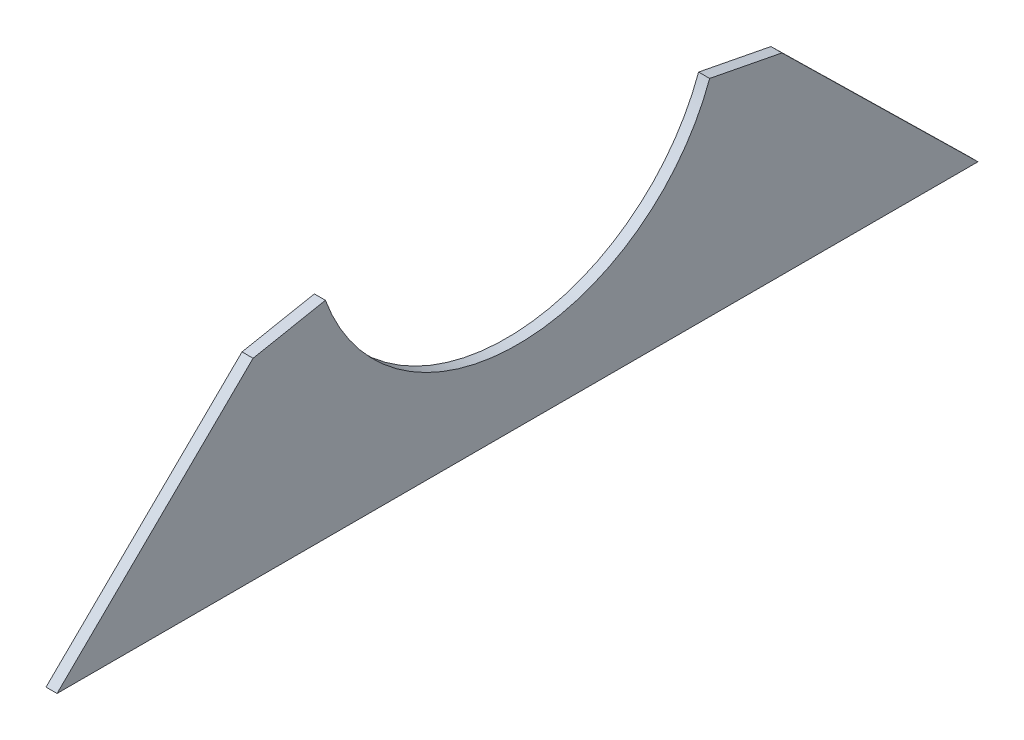
ISO-10303-21;
HEADER;
FILE_DESCRIPTION(('STEP AP214'),'2;1');
FILE_NAME('part.step','',(''),(''),'','','');
FILE_SCHEMA(('AUTOMOTIVE_DESIGN { 1 0 10303 214 1 1 1 1 }'));
ENDSEC;
DATA;
#1=APPLICATION_CONTEXT('core data for automotive mechanical design processes');
#2=APPLICATION_PROTOCOL_DEFINITION('international standard','automotive_design',2000,#1);
#3=PRODUCT_CONTEXT('',#1,'mechanical');
#4=PRODUCT('Part','Part','',(#3));
#5=PRODUCT_RELATED_PRODUCT_CATEGORY('part','',(#4));
#6=PRODUCT_DEFINITION_FORMATION('','',#4);
#7=PRODUCT_DEFINITION_CONTEXT('part definition',#1,'design');
#8=PRODUCT_DEFINITION('design','',#6,#7);
#9=PRODUCT_DEFINITION_SHAPE('','',#8);
#10=(LENGTH_UNIT() NAMED_UNIT(*) SI_UNIT(.MILLI.,.METRE.));
#11=(NAMED_UNIT(*) PLANE_ANGLE_UNIT() SI_UNIT($,.RADIAN.));
#12=(NAMED_UNIT(*) SI_UNIT($,.STERADIAN.) SOLID_ANGLE_UNIT());
#13=UNCERTAINTY_MEASURE_WITH_UNIT(LENGTH_MEASURE(1.E-05),#10,'distance_accuracy_value','');
#14=(GEOMETRIC_REPRESENTATION_CONTEXT(3) GLOBAL_UNCERTAINTY_ASSIGNED_CONTEXT((#13)) GLOBAL_UNIT_ASSIGNED_CONTEXT((#10,
#11,#12)) REPRESENTATION_CONTEXT('',''));
#15=CARTESIAN_POINT('',(0.,0.,0.));
#16=DIRECTION('',(0.,0.,1.));
#17=DIRECTION('',(1.,0.,0.));
#18=AXIS2_PLACEMENT_3D('',#15,#16,#17);
#19=CARTESIAN_POINT('',(-6.,-45.5965957242111,-143.570968245142));
#20=DIRECTION('',(0.,0.713867546087755,-0.70028074844497));
#21=DIRECTION('',(0.,0.70028074844497,0.713867546087755));
#22=AXIS2_PLACEMENT_3D('',#19,#20,#21);
#23=PLANE('',#22);
#24=DIRECTION('',(0.,0.70028074844497,0.713867546087755));
#25=VECTOR('',#24,1.);
#26=CARTESIAN_POINT('',(0.,-45.5965957242111,-143.570968245142));
#27=LINE('',#26,#25);
#28=CARTESIAN_POINT('',(0.,-150.,-250.));
#29=VERTEX_POINT('',#28);
#30=CARTESIAN_POINT('',(0.,-45.5965957242111,-143.570968245142));
#31=VERTEX_POINT('',#30);
#32=EDGE_CURVE('E130',#29,#31,#27,.T.);
#33=ORIENTED_EDGE('',*,*,#32,.F.);
#34=DIRECTION('',(1.,0.,0.));
#35=VECTOR('',#34,1.);
#36=CARTESIAN_POINT('',(-6.,-150.,-250.));
#37=LINE('',#36,#35);
#38=CARTESIAN_POINT('',(-6.,-150.,-250.));
#39=VERTEX_POINT('',#38);
#40=EDGE_CURVE('E11',#39,#29,#37,.T.);
#41=ORIENTED_EDGE('',*,*,#40,.F.);
#42=DIRECTION('',(0.,0.70028074844497,0.713867546087755));
#43=VECTOR('',#42,1.);
#44=CARTESIAN_POINT('',(-6.,-45.5965957242111,-143.570968245142));
#45=LINE('',#44,#43);
#46=CARTESIAN_POINT('',(-6.,-45.5965957242111,-143.570968245142));
#47=VERTEX_POINT('',#46);
#48=EDGE_CURVE('E144',#39,#47,#45,.T.);
#49=ORIENTED_EDGE('',*,*,#48,.T.);
#50=DIRECTION('',(1.,0.,0.));
#51=VECTOR('',#50,1.);
#52=CARTESIAN_POINT('',(-6.,-45.5965957242111,-143.570968245142));
#53=LINE('',#52,#51);
#54=EDGE_CURVE('E48',#47,#31,#53,.T.);
#55=ORIENTED_EDGE('',*,*,#54,.T.);
#56=EDGE_LOOP('',(#33,#41,#49,#55));
#57=FACE_BOUND('',#56,.T.);
#58=ADVANCED_FACE('F45',(#57),#23,.T.);
#59=CARTESIAN_POINT('',(-6.,-150.,-250.));
#60=DIRECTION('',(0.,-1.,0.));
#61=DIRECTION('',(0.,0.,-1.));
#62=AXIS2_PLACEMENT_3D('',#59,#60,#61);
#63=PLANE('',#62);
#64=DIRECTION('',(0.,0.,-1.));
#65=VECTOR('',#64,1.);
#66=CARTESIAN_POINT('',(0.,-150.,-250.));
#67=LINE('',#66,#65);
#68=CARTESIAN_POINT('',(0.,-150.,250.));
#69=VERTEX_POINT('',#68);
#70=EDGE_CURVE('E142',#69,#29,#67,.T.);
#71=ORIENTED_EDGE('',*,*,#70,.F.);
#72=DIRECTION('',(1.,0.,0.));
#73=VECTOR('',#72,1.);
#74=CARTESIAN_POINT('',(-6.,-150.,250.));
#75=LINE('',#74,#73);
#76=CARTESIAN_POINT('',(-6.,-150.,250.));
#77=VERTEX_POINT('',#76);
#78=EDGE_CURVE('E54',#77,#69,#75,.T.);
#79=ORIENTED_EDGE('',*,*,#78,.F.);
#80=DIRECTION('',(0.,0.,-1.));
#81=VECTOR('',#80,1.);
#82=CARTESIAN_POINT('',(-6.,-150.,-250.));
#83=LINE('',#82,#81);
#84=EDGE_CURVE('E120',#77,#39,#83,.T.);
#85=ORIENTED_EDGE('',*,*,#84,.T.);
#86=ORIENTED_EDGE('',*,*,#40,.T.);
#87=EDGE_LOOP('',(#71,#79,#85,#86));
#88=FACE_BOUND('',#87,.T.);
#89=ADVANCED_FACE('F152',(#88),#63,.T.);
#90=CARTESIAN_POINT('',(-6.,-45.5965957242111,143.570968245142));
#91=DIRECTION('',(0.,0.713867546087754,0.70028074844497));
#92=DIRECTION('',(0.,-0.70028074844497,0.713867546087754));
#93=AXIS2_PLACEMENT_3D('',#90,#91,#92);
#94=PLANE('',#93);
#95=DIRECTION('',(0.,-0.70028074844497,0.713867546087754));
#96=VECTOR('',#95,1.);
#97=CARTESIAN_POINT('',(0.,-45.5965957242111,143.570968245142));
#98=LINE('',#97,#96);
#99=CARTESIAN_POINT('',(0.,-45.5965957242111,143.570968245142));
#100=VERTEX_POINT('',#99);
#101=EDGE_CURVE('E107',#100,#69,#98,.T.);
#102=ORIENTED_EDGE('',*,*,#101,.F.);
#103=DIRECTION('',(1.,0.,0.));
#104=VECTOR('',#103,1.);
#105=CARTESIAN_POINT('',(-6.,-45.5965957242111,143.570968245142));
#106=LINE('',#105,#104);
#107=CARTESIAN_POINT('',(-6.,-45.5965957242111,143.570968245142));
#108=VERTEX_POINT('',#107);
#109=EDGE_CURVE('E102',#108,#100,#106,.T.);
#110=ORIENTED_EDGE('',*,*,#109,.F.);
#111=DIRECTION('',(0.,-0.70028074844497,0.713867546087754));
#112=VECTOR('',#111,1.);
#113=CARTESIAN_POINT('',(-6.,-45.5965957242111,143.570968245142));
#114=LINE('',#113,#112);
#115=EDGE_CURVE('E105',#108,#77,#114,.T.);
#116=ORIENTED_EDGE('',*,*,#115,.T.);
#117=ORIENTED_EDGE('',*,*,#78,.T.);
#118=EDGE_LOOP('',(#102,#110,#116,#117));
#119=FACE_BOUND('',#118,.T.);
#120=ADVANCED_FACE('F104',(#119),#94,.T.);
#121=CARTESIAN_POINT('',(-6.,-37.9642359091493,104.305880907236));
#122=DIRECTION('',(0.,0.981627183447664,0.190808995376544));
#123=DIRECTION('',(0.,-0.190808995376544,0.981627183447664));
#124=AXIS2_PLACEMENT_3D('',#121,#122,#123);
#125=PLANE('',#124);
#126=DIRECTION('',(0.,-0.190808995376544,0.981627183447664));
#127=VECTOR('',#126,1.);
#128=CARTESIAN_POINT('',(0.,-37.9642359091493,104.305880907236));
#129=LINE('',#128,#127);
#130=CARTESIAN_POINT('',(0.,-37.9642359091493,104.305880907236));
#131=VERTEX_POINT('',#130);
#132=EDGE_CURVE('E139',#131,#100,#129,.T.);
#133=ORIENTED_EDGE('',*,*,#132,.F.);
#134=DIRECTION('',(1.,0.,0.));
#135=VECTOR('',#134,1.);
#136=CARTESIAN_POINT('',(-6.,-37.9642359091493,104.305880907236));
#137=LINE('',#136,#135);
#138=CARTESIAN_POINT('',(-6.,-37.9642359091493,104.305880907236));
#139=VERTEX_POINT('',#138);
#140=EDGE_CURVE('E112',#139,#131,#137,.T.);
#141=ORIENTED_EDGE('',*,*,#140,.F.);
#142=DIRECTION('',(0.,-0.190808995376544,0.981627183447664));
#143=VECTOR('',#142,1.);
#144=CARTESIAN_POINT('',(-6.,-37.9642359091493,104.305880907236));
#145=LINE('',#144,#143);
#146=EDGE_CURVE('E118',#139,#108,#145,.T.);
#147=ORIENTED_EDGE('',*,*,#146,.T.);
#148=ORIENTED_EDGE('',*,*,#109,.T.);
#149=EDGE_LOOP('',(#133,#141,#147,#148));
#150=FACE_BOUND('',#149,.T.);
#151=ADVANCED_FACE('F122',(#150),#125,.T.);
#152=CARTESIAN_POINT('',(-6.,0.,0.));
#153=DIRECTION('',(1.,0.,0.));
#154=DIRECTION('',(0.,0.,-1.));
#155=AXIS2_PLACEMENT_3D('',#152,#153,#154);
#156=CYLINDRICAL_SURFACE('',#155,111.);
#157=CARTESIAN_POINT('',(0.,0.,0.));
#158=DIRECTION('',(-1.,0.,0.));
#159=DIRECTION('',(0.,0.,-1.));
#160=AXIS2_PLACEMENT_3D('',#157,#158,#159);
#161=CIRCLE('',#160,111.);
#162=CARTESIAN_POINT('',(0.,-37.9642359091493,-104.305880907236));
#163=VERTEX_POINT('',#162);
#164=EDGE_CURVE('E136',#163,#131,#161,.T.);
#165=ORIENTED_EDGE('',*,*,#164,.F.);
#166=DIRECTION('',(1.,0.,0.));
#167=VECTOR('',#166,1.);
#168=CARTESIAN_POINT('',(-6.,-37.9642359091493,-104.305880907236));
#169=LINE('',#168,#167);
#170=CARTESIAN_POINT('',(-6.,-37.9642359091493,-104.305880907236));
#171=VERTEX_POINT('',#170);
#172=EDGE_CURVE('E147',#171,#163,#169,.T.);
#173=ORIENTED_EDGE('',*,*,#172,.F.);
#174=CARTESIAN_POINT('',(-6.,0.,0.));
#175=DIRECTION('',(-1.,0.,0.));
#176=DIRECTION('',(0.,0.,-1.));
#177=AXIS2_PLACEMENT_3D('',#174,#175,#176);
#178=CIRCLE('',#177,111.);
#179=EDGE_CURVE('E123',#171,#139,#178,.T.);
#180=ORIENTED_EDGE('',*,*,#179,.T.);
#181=ORIENTED_EDGE('',*,*,#140,.T.);
#182=EDGE_LOOP('',(#165,#173,#180,#181));
#183=FACE_BOUND('',#182,.T.);
#184=ADVANCED_FACE('F165',(#183),#156,.F.);
#185=CARTESIAN_POINT('',(-6.,-37.9642359091493,-104.305880907236));
#186=DIRECTION('',(0.,0.981627183447664,-0.190808995376544));
#187=DIRECTION('',(0.,0.190808995376544,0.981627183447664));
#188=AXIS2_PLACEMENT_3D('',#185,#186,#187);
#189=PLANE('',#188);
#190=DIRECTION('',(0.,0.190808995376544,0.981627183447664));
#191=VECTOR('',#190,1.);
#192=CARTESIAN_POINT('',(0.,-37.9642359091493,-104.305880907236));
#193=LINE('',#192,#191);
#194=EDGE_CURVE('E133',#31,#163,#193,.T.);
#195=ORIENTED_EDGE('',*,*,#194,.F.);
#196=ORIENTED_EDGE('',*,*,#54,.F.);
#197=DIRECTION('',(0.,0.190808995376544,0.981627183447664));
#198=VECTOR('',#197,1.);
#199=CARTESIAN_POINT('',(-6.,-37.9642359091493,-104.305880907236));
#200=LINE('',#199,#198);
#201=EDGE_CURVE('E125',#47,#171,#200,.T.);
#202=ORIENTED_EDGE('',*,*,#201,.T.);
#203=ORIENTED_EDGE('',*,*,#172,.T.);
#204=EDGE_LOOP('',(#195,#196,#202,#203));
#205=FACE_BOUND('',#204,.T.);
#206=ADVANCED_FACE('F149',(#205),#189,.T.);
#207=CARTESIAN_POINT('',(-6.,0.,0.));
#208=DIRECTION('',(1.,0.,0.));
#209=DIRECTION('',(0.,0.,-1.));
#210=AXIS2_PLACEMENT_3D('',#207,#208,#209);
#211=PLANE('',#210);
#212=ORIENTED_EDGE('',*,*,#48,.F.);
#213=ORIENTED_EDGE('',*,*,#84,.F.);
#214=ORIENTED_EDGE('',*,*,#115,.F.);
#215=ORIENTED_EDGE('',*,*,#146,.F.);
#216=ORIENTED_EDGE('',*,*,#179,.F.);
#217=ORIENTED_EDGE('',*,*,#201,.F.);
#218=EDGE_LOOP('',(#212,#213,#214,#215,#216,#217));
#219=FACE_BOUND('',#218,.T.);
#220=ADVANCED_FACE('F116',(#219),#211,.F.);
#221=CARTESIAN_POINT('',(0.,0.,0.));
#222=DIRECTION('',(1.,0.,0.));
#223=DIRECTION('',(0.,0.,-1.));
#224=AXIS2_PLACEMENT_3D('',#221,#222,#223);
#225=PLANE('',#224);
#226=ORIENTED_EDGE('',*,*,#32,.T.);
#227=ORIENTED_EDGE('',*,*,#194,.T.);
#228=ORIENTED_EDGE('',*,*,#164,.T.);
#229=ORIENTED_EDGE('',*,*,#132,.T.);
#230=ORIENTED_EDGE('',*,*,#101,.T.);
#231=ORIENTED_EDGE('',*,*,#70,.T.);
#232=EDGE_LOOP('',(#226,#227,#228,#229,#230,#231));
#233=FACE_BOUND('',#232,.T.);
#234=ADVANCED_FACE('F151',(#233),#225,.T.);
#235=CLOSED_SHELL('',(#58,#89,#120,#151,#184,#206,#220,#234));
#236=MANIFOLD_SOLID_BREP('B2',#235);
#237=ADVANCED_BREP_SHAPE_REPRESENTATION('',(#18,#236),#14);
#238=SHAPE_DEFINITION_REPRESENTATION(#9,#237);
ENDSEC;
END-ISO-10303-21;
